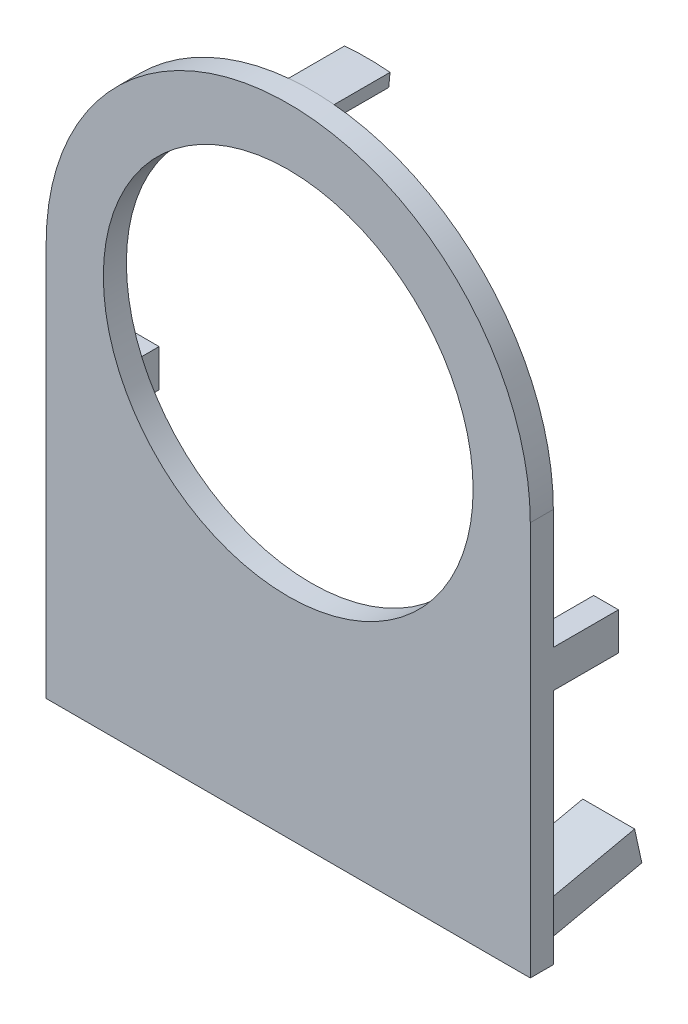
ISO-10303-21;
HEADER;
FILE_DESCRIPTION(('STEP AP214'),'2;1');
FILE_NAME('part.step','',(''),(''),'','','');
FILE_SCHEMA(('AUTOMOTIVE_DESIGN { 1 0 10303 214 1 1 1 1 }'));
ENDSEC;
DATA;
#1=APPLICATION_CONTEXT('core data for automotive mechanical design processes');
#2=APPLICATION_PROTOCOL_DEFINITION('international standard','automotive_design',2000,#1);
#3=PRODUCT_CONTEXT('',#1,'mechanical');
#4=PRODUCT('Part','Part','',(#3));
#5=PRODUCT_RELATED_PRODUCT_CATEGORY('part','',(#4));
#6=PRODUCT_DEFINITION_FORMATION('','',#4);
#7=PRODUCT_DEFINITION_CONTEXT('part definition',#1,'design');
#8=PRODUCT_DEFINITION('design','',#6,#7);
#9=PRODUCT_DEFINITION_SHAPE('','',#8);
#10=(LENGTH_UNIT() NAMED_UNIT(*) SI_UNIT(.MILLI.,.METRE.));
#11=(NAMED_UNIT(*) PLANE_ANGLE_UNIT() SI_UNIT($,.RADIAN.));
#12=(NAMED_UNIT(*) SI_UNIT($,.STERADIAN.) SOLID_ANGLE_UNIT());
#13=UNCERTAINTY_MEASURE_WITH_UNIT(LENGTH_MEASURE(1.E-05),#10,'distance_accuracy_value','');
#14=(GEOMETRIC_REPRESENTATION_CONTEXT(3) GLOBAL_UNCERTAINTY_ASSIGNED_CONTEXT((#13)) GLOBAL_UNIT_ASSIGNED_CONTEXT((#10,
#11,#12)) REPRESENTATION_CONTEXT('',''));
#15=CARTESIAN_POINT('',(0.,0.,0.));
#16=DIRECTION('',(0.,0.,1.));
#17=DIRECTION('',(1.,0.,0.));
#18=AXIS2_PLACEMENT_3D('',#15,#16,#17);
#19=CARTESIAN_POINT('',(0.,0.,42.));
#20=DIRECTION('',(0.,0.,1.));
#21=DIRECTION('',(1.,0.,0.));
#22=AXIS2_PLACEMENT_3D('',#19,#20,#21);
#23=PLANE('',#22);
#24=CARTESIAN_POINT('',(0.,0.,42.));
#25=DIRECTION('',(0.,0.,1.));
#26=DIRECTION('',(1.,0.,0.));
#27=AXIS2_PLACEMENT_3D('',#24,#25,#26);
#28=CIRCLE('',#27,16.04);
#29=CARTESIAN_POINT('',(16.04,0.,42.));
#30=VERTEX_POINT('',#29);
#31=EDGE_CURVE('E370',#30,#30,#28,.T.);
#32=ORIENTED_EDGE('',*,*,#31,.T.);
#33=EDGE_LOOP('',(#32));
#34=FACE_BOUND('',#33,.T.);
#35=DIRECTION('',(0.,-1.,0.));
#36=VECTOR('',#35,1.);
#37=CARTESIAN_POINT('',(-19.25,-21.4379492860773,42.));
#38=LINE('',#37,#36);
#39=CARTESIAN_POINT('',(-19.25,-31.2047703418054,42.));
#40=VERTEX_POINT('',#39);
#41=CARTESIAN_POINT('',(-19.25,-34.2047703418054,42.));
#42=VERTEX_POINT('',#41);
#43=EDGE_CURVE('E218',#40,#42,#38,.T.);
#44=ORIENTED_EDGE('',*,*,#43,.T.);
#45=DIRECTION('',(1.,0.,0.));
#46=VECTOR('',#45,1.);
#47=CARTESIAN_POINT('',(-21.,-34.2047703418054,42.));
#48=LINE('',#47,#46);
#49=CARTESIAN_POINT('',(-21.,-34.2047703418054,42.));
#50=VERTEX_POINT('',#49);
#51=EDGE_CURVE('E377',#50,#42,#48,.T.);
#52=ORIENTED_EDGE('',*,*,#51,.F.);
#53=DIRECTION('',(0.,-1.,0.));
#54=VECTOR('',#53,1.);
#55=CARTESIAN_POINT('',(-21.,-14.0641329223108,42.));
#56=LINE('',#55,#54);
#57=CARTESIAN_POINT('',(-21.,-13.7641329223108,42.));
#58=VERTEX_POINT('',#57);
#59=EDGE_CURVE('E458',#58,#50,#56,.T.);
#60=ORIENTED_EDGE('',*,*,#59,.F.);
#61=DIRECTION('',(1.,0.,0.));
#62=VECTOR('',#61,1.);
#63=CARTESIAN_POINT('',(-21.,-13.7641329223108,42.));
#64=LINE('',#63,#62);
#65=CARTESIAN_POINT('',(-18.85,-13.7641329223108,42.));
#66=VERTEX_POINT('',#65);
#67=EDGE_CURVE('E295',#58,#66,#64,.T.);
#68=ORIENTED_EDGE('',*,*,#67,.T.);
#69=DIRECTION('',(0.,1.,0.));
#70=VECTOR('',#69,1.);
#71=CARTESIAN_POINT('',(-18.85,-10.2141329223108,42.));
#72=LINE('',#71,#70);
#73=CARTESIAN_POINT('',(-18.85,-10.5141329223108,42.));
#74=VERTEX_POINT('',#73);
#75=EDGE_CURVE('E323',#66,#74,#72,.T.);
#76=ORIENTED_EDGE('',*,*,#75,.T.);
#77=DIRECTION('',(-1.,0.,0.));
#78=VECTOR('',#77,1.);
#79=CARTESIAN_POINT('',(-18.85,-10.5141329223108,42.));
#80=LINE('',#79,#78);
#81=CARTESIAN_POINT('',(-21.,-10.5141329223108,42.));
#82=VERTEX_POINT('',#81);
#83=EDGE_CURVE('E303',#74,#82,#80,.T.);
#84=ORIENTED_EDGE('',*,*,#83,.T.);
#85=CARTESIAN_POINT('',(-21.,0.,42.));
#86=VERTEX_POINT('',#85);
#87=EDGE_CURVE('E389',#86,#82,#56,.T.);
#88=ORIENTED_EDGE('',*,*,#87,.F.);
#89=CARTESIAN_POINT('',(0.,0.,42.));
#90=DIRECTION('',(0.,0.,1.));
#91=DIRECTION('',(1.,0.,0.));
#92=AXIS2_PLACEMENT_3D('',#89,#90,#91);
#93=CIRCLE('',#92,21.);
#94=CARTESIAN_POINT('',(-1.78913083156493,20.9236471693523,42.));
#95=VERTEX_POINT('',#94);
#96=EDGE_CURVE('E386',#95,#86,#93,.T.);
#97=ORIENTED_EDGE('',*,*,#96,.F.);
#98=CARTESIAN_POINT('',(1.98333797025892,20.9060681525341,42.));
#99=CARTESIAN_POINT('',(1.32410684495105,20.9688240892851,42.));
#100=CARTESIAN_POINT('',(0.00385608887355169,21.0318291108314,42.));
#101=CARTESIAN_POINT('',(-1.31639466720395,20.9691910581041,42.));
#102=CARTESIAN_POINT('',(-1.97181873184604,20.9071615352025,42.));
#103=B_SPLINE_CURVE_WITH_KNOTS('',3,(#98,#99,#100,#101,#102),.UNSPECIFIED.,.F.,.F.,(4,1,4),
(0.632808650119649,0.654019793730495,0.675107394358108),.UNSPECIFIED.);
#104=CARTESIAN_POINT('',(-1.97181873184604,20.9071615352025,42.));
#105=VERTEX_POINT('',#104);
#106=EDGE_CURVE('E227',#95,#105,#103,.T.);
#107=ORIENTED_EDGE('',*,*,#106,.T.);
#108=DIRECTION('',(0.0942192787541509,-0.99555146904168,0.));
#109=VECTOR('',#108,1.);
#110=CARTESIAN_POINT('',(-1.85894403589857,19.7144908752906,42.));
#111=LINE('',#110,#109);
#112=CARTESIAN_POINT('',(-1.85894403589857,19.7144908752906,42.));
#113=VERTEX_POINT('',#112);
#114=EDGE_CURVE('E413',#105,#113,#111,.T.);
#115=ORIENTED_EDGE('',*,*,#114,.T.);
#116=CARTESIAN_POINT('',(-1.85894403589857,19.7144908752906,42.));
#117=CARTESIAN_POINT('',(-1.54909634243908,19.7438149505485,42.));
#118=CARTESIAN_POINT('',(-0.927804945098241,19.7878796223772,42.));
#119=CARTESIAN_POINT('',(0.00545184072156578,19.8098164315136,42.));
#120=CARTESIAN_POINT('',(0.938704489057926,19.7873617674215,42.));
#121=CARTESIAN_POINT('',(1.55997378818764,19.7429545593892,42.));
#122=CARTESIAN_POINT('',(1.86980684063082,19.7134597999701,42.));
#123=B_SPLINE_CURVE_WITH_KNOTS('',3,(#116,#117,#118,#119,#120,#121,#122),.UNSPECIFIED.,.F.,.F.,
(4,1,1,1,4),(0.632808650119649,0.643383336179264,0.653958022238878,0.664532708298493,
0.675107394358108),.UNSPECIFIED.);
#124=CARTESIAN_POINT('',(1.86980684063082,19.7134597999701,42.));
#125=VERTEX_POINT('',#124);
#126=EDGE_CURVE('E424',#113,#125,#123,.T.);
#127=ORIENTED_EDGE('',*,*,#126,.T.);
#128=DIRECTION('',(0.0947672200568778,0.995499459569261,0.));
#129=VECTOR('',#128,1.);
#130=CARTESIAN_POINT('',(1.86980684063082,19.7134597999701,42.));
#131=LINE('',#130,#129);
#132=CARTESIAN_POINT('',(1.98333797025896,20.9060681525341,42.));
#133=VERTEX_POINT('',#132);
#134=EDGE_CURVE('E417',#125,#133,#131,.T.);
#135=ORIENTED_EDGE('',*,*,#134,.T.);
#136=CARTESIAN_POINT('',(1.78913083154189,20.9236471693542,42.));
#137=VERTEX_POINT('',#136);
#138=EDGE_CURVE('E329',#133,#137,#103,.T.);
#139=ORIENTED_EDGE('',*,*,#138,.T.);
#140=CARTESIAN_POINT('',(21.,0.,42.));
#141=VERTEX_POINT('',#140);
#142=EDGE_CURVE('E393',#141,#137,#93,.T.);
#143=ORIENTED_EDGE('',*,*,#142,.F.);
#144=DIRECTION('',(0.,1.,0.));
#145=VECTOR('',#144,1.);
#146=CARTESIAN_POINT('',(21.,0.,42.));
#147=LINE('',#146,#145);
#148=CARTESIAN_POINT('',(21.,-10.3641329223108,42.));
#149=VERTEX_POINT('',#148);
#150=EDGE_CURVE('E369',#149,#141,#147,.T.);
#151=ORIENTED_EDGE('',*,*,#150,.F.);
#152=DIRECTION('',(-1.,0.,0.));
#153=VECTOR('',#152,1.);
#154=CARTESIAN_POINT('',(18.85,-10.3641329223108,42.));
#155=LINE('',#154,#153);
#156=CARTESIAN_POINT('',(18.85,-10.3641329223108,42.));
#157=VERTEX_POINT('',#156);
#158=EDGE_CURVE('E317',#149,#157,#155,.T.);
#159=ORIENTED_EDGE('',*,*,#158,.T.);
#160=DIRECTION('',(0.,-1.,0.));
#161=VECTOR('',#160,1.);
#162=CARTESIAN_POINT('',(18.85,-10.0641329223108,42.));
#163=LINE('',#162,#161);
#164=CARTESIAN_POINT('',(18.85,-13.6141329223108,42.));
#165=VERTEX_POINT('',#164);
#166=EDGE_CURVE('E326',#157,#165,#163,.T.);
#167=ORIENTED_EDGE('',*,*,#166,.T.);
#168=DIRECTION('',(1.,0.,0.));
#169=VECTOR('',#168,1.);
#170=CARTESIAN_POINT('',(18.85,-13.6141329223108,42.));
#171=LINE('',#170,#169);
#172=CARTESIAN_POINT('',(21.,-13.6141329223108,42.));
#173=VERTEX_POINT('',#172);
#174=EDGE_CURVE('E306',#165,#173,#171,.T.);
#175=ORIENTED_EDGE('',*,*,#174,.T.);
#176=CARTESIAN_POINT('',(21.,-34.2047703418054,42.));
#177=VERTEX_POINT('',#176);
#178=EDGE_CURVE('E384',#177,#173,#147,.T.);
#179=ORIENTED_EDGE('',*,*,#178,.F.);
#180=CARTESIAN_POINT('',(19.25,-34.2047703418054,42.));
#181=VERTEX_POINT('',#180);
#182=EDGE_CURVE('E463',#181,#177,#48,.T.);
#183=ORIENTED_EDGE('',*,*,#182,.F.);
#184=DIRECTION('',(0.,-1.,0.));
#185=VECTOR('',#184,1.);
#186=CARTESIAN_POINT('',(19.25,-21.4379492860773,42.));
#187=LINE('',#186,#185);
#188=CARTESIAN_POINT('',(19.25,-31.2047703418054,42.));
#189=VERTEX_POINT('',#188);
#190=EDGE_CURVE('E497',#189,#181,#187,.T.);
#191=ORIENTED_EDGE('',*,*,#190,.F.);
#192=DIRECTION('',(-1.,0.,0.));
#193=VECTOR('',#192,1.);
#194=CARTESIAN_POINT('',(19.5,-31.2047703418054,42.));
#195=LINE('',#194,#193);
#196=CARTESIAN_POINT('',(14.75,-31.2047703418054,42.));
#197=VERTEX_POINT('',#196);
#198=EDGE_CURVE('E284',#189,#197,#195,.T.);
#199=ORIENTED_EDGE('',*,*,#198,.T.);
#200=DIRECTION('',(0.,-1.,0.));
#201=VECTOR('',#200,1.);
#202=CARTESIAN_POINT('',(14.75,-21.4379492860773,42.));
#203=LINE('',#202,#201);
#204=CARTESIAN_POINT('',(14.75,-34.2047703418054,42.));
#205=VERTEX_POINT('',#204);
#206=EDGE_CURVE('E490',#197,#205,#203,.T.);
#207=ORIENTED_EDGE('',*,*,#206,.T.);
#208=CARTESIAN_POINT('',(-14.75,-34.2047703418054,42.));
#209=VERTEX_POINT('',#208);
#210=EDGE_CURVE('E467',#209,#205,#48,.T.);
#211=ORIENTED_EDGE('',*,*,#210,.F.);
#212=DIRECTION('',(0.,-1.,0.));
#213=VECTOR('',#212,1.);
#214=CARTESIAN_POINT('',(-14.75,-21.4379492860773,42.));
#215=LINE('',#214,#213);
#216=CARTESIAN_POINT('',(-14.75,-31.2047703418054,42.));
#217=VERTEX_POINT('',#216);
#218=EDGE_CURVE('E483',#217,#209,#215,.T.);
#219=ORIENTED_EDGE('',*,*,#218,.F.);
#220=DIRECTION('',(1.,0.,0.));
#221=VECTOR('',#220,1.);
#222=CARTESIAN_POINT('',(-19.5,-31.2047703418054,42.));
#223=LINE('',#222,#221);
#224=EDGE_CURVE('E280',#40,#217,#223,.T.);
#225=ORIENTED_EDGE('',*,*,#224,.F.);
#226=EDGE_LOOP('',(#44,#52,#60,#68,#76,#84,#88,#97,#107,#115,#127,#135,#139,#143,#151,#159,#167,
#175,#179,#183,#191,#199,#207,#211,#219,#225));
#227=FACE_BOUND('',#226,.T.);
#228=ADVANCED_FACE('F39',(#34,#227),#23,.F.);
#229=CARTESIAN_POINT('',(0.,0.,44.));
#230=DIRECTION('',(0.,0.,1.));
#231=DIRECTION('',(1.,0.,0.));
#232=AXIS2_PLACEMENT_3D('',#229,#230,#231);
#233=PLANE('',#232);
#234=DIRECTION('',(0.,1.,0.));
#235=VECTOR('',#234,1.);
#236=CARTESIAN_POINT('',(21.,-34.2047703418054,44.));
#237=LINE('',#236,#235);
#238=CARTESIAN_POINT('',(21.,-34.2047703418054,44.));
#239=VERTEX_POINT('',#238);
#240=CARTESIAN_POINT('',(21.,0.,44.));
#241=VERTEX_POINT('',#240);
#242=EDGE_CURVE('E374',#239,#241,#237,.T.);
#243=ORIENTED_EDGE('',*,*,#242,.T.);
#244=CARTESIAN_POINT('',(0.,0.,44.));
#245=DIRECTION('',(0.,0.,1.));
#246=DIRECTION('',(1.,0.,0.));
#247=AXIS2_PLACEMENT_3D('',#244,#245,#246);
#248=CIRCLE('',#247,21.);
#249=CARTESIAN_POINT('',(-21.,0.,44.));
#250=VERTEX_POINT('',#249);
#251=EDGE_CURVE('E376',#241,#250,#248,.T.);
#252=ORIENTED_EDGE('',*,*,#251,.T.);
#253=DIRECTION('',(0.,-1.,0.));
#254=VECTOR('',#253,1.);
#255=CARTESIAN_POINT('',(-21.,0.,44.));
#256=LINE('',#255,#254);
#257=CARTESIAN_POINT('',(-21.,-34.2047703418054,44.));
#258=VERTEX_POINT('',#257);
#259=EDGE_CURVE('E379',#250,#258,#256,.T.);
#260=ORIENTED_EDGE('',*,*,#259,.T.);
#261=DIRECTION('',(1.,0.,0.));
#262=VECTOR('',#261,1.);
#263=CARTESIAN_POINT('',(-21.,-34.2047703418054,44.));
#264=LINE('',#263,#262);
#265=EDGE_CURVE('E381',#258,#239,#264,.T.);
#266=ORIENTED_EDGE('',*,*,#265,.T.);
#267=EDGE_LOOP('',(#243,#252,#260,#266));
#268=FACE_BOUND('',#267,.T.);
#269=CARTESIAN_POINT('',(0.,0.,44.));
#270=DIRECTION('',(0.,0.,1.));
#271=DIRECTION('',(1.,0.,0.));
#272=AXIS2_PLACEMENT_3D('',#269,#270,#271);
#273=CIRCLE('',#272,16.04);
#274=CARTESIAN_POINT('',(16.04,0.,44.));
#275=VERTEX_POINT('',#274);
#276=EDGE_CURVE('E361',#275,#275,#273,.T.);
#277=ORIENTED_EDGE('',*,*,#276,.F.);
#278=EDGE_LOOP('',(#277));
#279=FACE_BOUND('',#278,.T.);
#280=ADVANCED_FACE('F520',(#268,#279),#233,.T.);
#281=CARTESIAN_POINT('',(21.,0.,44.));
#282=DIRECTION('',(-1.,0.,0.));
#283=DIRECTION('',(0.,-1.,0.));
#284=AXIS2_PLACEMENT_3D('',#281,#282,#283);
#285=PLANE('',#284);
#286=DIRECTION('',(0.,0.,-1.));
#287=VECTOR('',#286,1.);
#288=CARTESIAN_POINT('',(21.,-13.6141329223108,44.1708293346092));
#289=LINE('',#288,#287);
#290=CARTESIAN_POINT('',(21.,-13.6141329223108,36.35));
#291=VERTEX_POINT('',#290);
#292=EDGE_CURVE('E302',#173,#291,#289,.T.);
#293=ORIENTED_EDGE('',*,*,#292,.T.);
#294=DIRECTION('',(0.,-1.,0.));
#295=VECTOR('',#294,1.);
#296=CARTESIAN_POINT('',(21.,-15.1139710254063,36.35));
#297=LINE('',#296,#295);
#298=CARTESIAN_POINT('',(21.,-10.3641329223108,36.35));
#299=VERTEX_POINT('',#298);
#300=EDGE_CURVE('E255',#299,#291,#297,.T.);
#301=ORIENTED_EDGE('',*,*,#300,.F.);
#302=DIRECTION('',(0.,0.,-1.));
#303=VECTOR('',#302,1.);
#304=CARTESIAN_POINT('',(21.,-10.3641329223108,44.1708293346092));
#305=LINE('',#304,#303);
#306=EDGE_CURVE('E309',#149,#299,#305,.T.);
#307=ORIENTED_EDGE('',*,*,#306,.F.);
#308=ORIENTED_EDGE('',*,*,#150,.T.);
#309=DIRECTION('',(0.,0.,-1.));
#310=VECTOR('',#309,1.);
#311=CARTESIAN_POINT('',(21.,0.,44.));
#312=LINE('',#311,#310);
#313=EDGE_CURVE('E399',#241,#141,#312,.T.);
#314=ORIENTED_EDGE('',*,*,#313,.F.);
#315=ORIENTED_EDGE('',*,*,#242,.F.);
#316=DIRECTION('',(0.,0.,-1.));
#317=VECTOR('',#316,1.);
#318=CARTESIAN_POINT('',(21.,-34.2047703418054,44.));
#319=LINE('',#318,#317);
#320=EDGE_CURVE('E383',#239,#177,#319,.T.);
#321=ORIENTED_EDGE('',*,*,#320,.T.);
#322=ORIENTED_EDGE('',*,*,#178,.T.);
#323=EDGE_LOOP('',(#293,#301,#307,#308,#314,#315,#321,#322));
#324=FACE_BOUND('',#323,.T.);
#325=ADVANCED_FACE('F41',(#324),#285,.F.);
#326=CARTESIAN_POINT('',(0.,0.,44.));
#327=DIRECTION('',(0.,0.,-1.));
#328=DIRECTION('',(-1.,0.,0.));
#329=AXIS2_PLACEMENT_3D('',#326,#327,#328);
#330=CYLINDRICAL_SURFACE('',#329,21.);
#331=ORIENTED_EDGE('',*,*,#142,.T.);
#332=CARTESIAN_POINT('',(-1.78913083156494,20.9236471693523,42.));
#333=CARTESIAN_POINT('',(-1.19413395904744,20.9747222381822,42.));
#334=CARTESIAN_POINT('',(-7.7056958903976E-12,21.0261149822509,42.));
#335=CARTESIAN_POINT('',(1.19413395903203,20.9747222381829,42.));
#336=CARTESIAN_POINT('',(1.7891308315419,20.9236471693543,42.));
#337=B_SPLINE_CURVE_WITH_KNOTS('',3,(#332,#333,#334,#335,#336),.UNSPECIFIED.,.F.,.F.,(4,1,4),
(0.634890712877089,0.654019793730742,0.673148874584148),.UNSPECIFIED.);
#338=EDGE_CURVE('E396',#137,#95,#337,.F.);
#339=ORIENTED_EDGE('',*,*,#338,.T.);
#340=ORIENTED_EDGE('',*,*,#96,.T.);
#341=DIRECTION('',(0.,0.,-1.));
#342=VECTOR('',#341,1.);
#343=CARTESIAN_POINT('',(-21.,0.,44.));
#344=LINE('',#343,#342);
#345=EDGE_CURVE('E516',#250,#86,#344,.T.);
#346=ORIENTED_EDGE('',*,*,#345,.F.);
#347=ORIENTED_EDGE('',*,*,#251,.F.);
#348=ORIENTED_EDGE('',*,*,#313,.T.);
#349=EDGE_LOOP('',(#331,#339,#340,#346,#347,#348));
#350=FACE_BOUND('',#349,.T.);
#351=ADVANCED_FACE('F455',(#350),#330,.T.);
#352=CARTESIAN_POINT('',(-21.,-14.0641329223108,44.));
#353=DIRECTION('',(1.,0.,0.));
#354=DIRECTION('',(0.,1.,0.));
#355=AXIS2_PLACEMENT_3D('',#352,#353,#354);
#356=PLANE('',#355);
#357=DIRECTION('',(0.,0.,-1.));
#358=VECTOR('',#357,1.);
#359=CARTESIAN_POINT('',(-21.,-10.5141329223108,44.1708293346092));
#360=LINE('',#359,#358);
#361=CARTESIAN_POINT('',(-21.,-10.5141329223108,36.35));
#362=VERTEX_POINT('',#361);
#363=EDGE_CURVE('E312',#82,#362,#360,.T.);
#364=ORIENTED_EDGE('',*,*,#363,.T.);
#365=DIRECTION('',(0.,-1.,0.));
#366=VECTOR('',#365,1.);
#367=CARTESIAN_POINT('',(-21.,-14.0641329223108,36.35));
#368=LINE('',#367,#366);
#369=CARTESIAN_POINT('',(-21.,-13.7641329223108,36.35));
#370=VERTEX_POINT('',#369);
#371=EDGE_CURVE('E265',#362,#370,#368,.T.);
#372=ORIENTED_EDGE('',*,*,#371,.T.);
#373=DIRECTION('',(0.,0.,-1.));
#374=VECTOR('',#373,1.);
#375=CARTESIAN_POINT('',(-21.,-13.7641329223108,44.1708293346092));
#376=LINE('',#375,#374);
#377=EDGE_CURVE('E289',#58,#370,#376,.T.);
#378=ORIENTED_EDGE('',*,*,#377,.F.);
#379=ORIENTED_EDGE('',*,*,#59,.T.);
#380=DIRECTION('',(0.,0.,-1.));
#381=VECTOR('',#380,1.);
#382=CARTESIAN_POINT('',(-21.,-34.2047703418054,44.));
#383=LINE('',#382,#381);
#384=EDGE_CURVE('E476',#258,#50,#383,.T.);
#385=ORIENTED_EDGE('',*,*,#384,.F.);
#386=ORIENTED_EDGE('',*,*,#259,.F.);
#387=ORIENTED_EDGE('',*,*,#345,.T.);
#388=ORIENTED_EDGE('',*,*,#87,.T.);
#389=EDGE_LOOP('',(#364,#372,#378,#379,#385,#386,#387,#388));
#390=FACE_BOUND('',#389,.T.);
#391=ADVANCED_FACE('F518',(#390),#356,.F.);
#392=CARTESIAN_POINT('',(-21.,-34.2047703418054,44.));
#393=DIRECTION('',(0.,1.,0.));
#394=DIRECTION('',(0.,0.,1.));
#395=AXIS2_PLACEMENT_3D('',#392,#393,#394);
#396=PLANE('',#395);
#397=ORIENTED_EDGE('',*,*,#51,.T.);
#398=DIRECTION('',(-1.,0.,0.));
#399=VECTOR('',#398,1.);
#400=CARTESIAN_POINT('',(-19.5,-34.2047703418054,42.));
#401=LINE('',#400,#399);
#402=EDGE_CURVE('E217',#209,#42,#401,.T.);
#403=ORIENTED_EDGE('',*,*,#402,.F.);
#404=ORIENTED_EDGE('',*,*,#210,.T.);
#405=DIRECTION('',(-1.,0.,0.));
#406=VECTOR('',#405,1.);
#407=CARTESIAN_POINT('',(19.5,-34.2047703418054,42.));
#408=LINE('',#407,#406);
#409=EDGE_CURVE('E286',#181,#205,#408,.T.);
#410=ORIENTED_EDGE('',*,*,#409,.F.);
#411=ORIENTED_EDGE('',*,*,#182,.T.);
#412=ORIENTED_EDGE('',*,*,#320,.F.);
#413=ORIENTED_EDGE('',*,*,#265,.F.);
#414=ORIENTED_EDGE('',*,*,#384,.T.);
#415=EDGE_LOOP('',(#397,#403,#404,#410,#411,#412,#413,#414));
#416=FACE_BOUND('',#415,.T.);
#417=ADVANCED_FACE('F474',(#416),#396,.F.);
#418=CARTESIAN_POINT('',(0.,0.,44.));
#419=DIRECTION('',(0.,0.,-1.));
#420=DIRECTION('',(-1.,0.,0.));
#421=AXIS2_PLACEMENT_3D('',#418,#419,#420);
#422=CYLINDRICAL_SURFACE('',#421,16.04);
#423=ORIENTED_EDGE('',*,*,#276,.T.);
#424=EDGE_LOOP('',(#423));
#425=FACE_BOUND('',#424,.T.);
#426=ORIENTED_EDGE('',*,*,#31,.F.);
#427=EDGE_LOOP('',(#426));
#428=FACE_BOUND('',#427,.T.);
#429=ADVANCED_FACE('F350',(#425,#428),#422,.F.);
#430=CARTESIAN_POINT('',(1.98333797025892,20.9060681525341,37.));
#431=CARTESIAN_POINT('',(1.32410684495105,20.9688240892851,37.));
#432=CARTESIAN_POINT('',(0.00385608887355169,21.0318291108314,37.));
#433=CARTESIAN_POINT('',(-1.31639466720395,20.9691910581041,37.));
#434=CARTESIAN_POINT('',(-1.97181873184604,20.9071615352025,37.));
#435=B_SPLINE_CURVE_WITH_KNOTS('',3,(#430,#431,#432,#433,#434),.UNSPECIFIED.,.F.,.F.,(4,1,4),
(0.632808650119649,0.654019793730495,0.675107394358108),.UNSPECIFIED.);
#436=DIRECTION('',(0.,0.,1.));
#437=VECTOR('',#436,1.);
#438=SURFACE_OF_LINEAR_EXTRUSION('',#435,#437);
#439=CARTESIAN_POINT('',(1.98333797025892,20.9060681525341,37.15));
#440=CARTESIAN_POINT('',(1.32410684495105,20.9688240892851,37.15));
#441=CARTESIAN_POINT('',(0.00385608887355169,21.0318291108314,37.15));
#442=CARTESIAN_POINT('',(-1.31639466720395,20.9691910581041,37.15));
#443=CARTESIAN_POINT('',(-1.97181873184604,20.9071615352025,37.15));
#444=B_SPLINE_CURVE_WITH_KNOTS('',3,(#439,#440,#441,#442,#443),.UNSPECIFIED.,.F.,.F.,(4,1,4),
(0.632808650119649,0.654019793730495,0.675107394358108),.UNSPECIFIED.);
#445=CARTESIAN_POINT('',(-1.97181873184604,20.9071615352025,37.15));
#446=VERTEX_POINT('',#445);
#447=CARTESIAN_POINT('',(1.98333797025896,20.9060681525341,37.15));
#448=VERTEX_POINT('',#447);
#449=EDGE_CURVE('E257',#446,#448,#444,.F.);
#450=ORIENTED_EDGE('',*,*,#449,.F.);
#451=DIRECTION('',(0.,0.,1.));
#452=VECTOR('',#451,1.);
#453=CARTESIAN_POINT('',(-1.97181873184604,20.9071615352025,37.));
#454=LINE('',#453,#452);
#455=EDGE_CURVE('E414',#446,#105,#454,.T.);
#456=ORIENTED_EDGE('',*,*,#455,.T.);
#457=ORIENTED_EDGE('',*,*,#106,.F.);
#458=ORIENTED_EDGE('',*,*,#338,.F.);
#459=ORIENTED_EDGE('',*,*,#138,.F.);
#460=DIRECTION('',(0.,0.,1.));
#461=VECTOR('',#460,1.);
#462=CARTESIAN_POINT('',(1.98333797025896,20.9060681525341,37.));
#463=LINE('',#462,#461);
#464=EDGE_CURVE('E373',#448,#133,#463,.T.);
#465=ORIENTED_EDGE('',*,*,#464,.F.);
#466=EDGE_LOOP('',(#450,#456,#457,#458,#459,#465));
#467=FACE_BOUND('',#466,.T.);
#468=ADVANCED_FACE('F344',(#467),#438,.T.);
#469=CARTESIAN_POINT('',(1.86980684063082,19.7134597999701,37.));
#470=DIRECTION('',(0.995499459569261,-0.0947672200568778,0.));
#471=DIRECTION('',(0.0947672200568778,0.995499459569261,0.));
#472=AXIS2_PLACEMENT_3D('',#469,#470,#471);
#473=PLANE('',#472);
#474=DIRECTION('',(-0.0947672200568778,-0.995499459569261,0.));
#475=VECTOR('',#474,1.);
#476=CARTESIAN_POINT('',(2.06990503626383,21.8154276058622,37.15));
#477=LINE('',#476,#475);
#478=CARTESIAN_POINT('',(1.86980684063082,19.7134597999701,37.15));
#479=VERTEX_POINT('',#478);
#480=EDGE_CURVE('E500',#448,#479,#477,.T.);
#481=ORIENTED_EDGE('',*,*,#480,.F.);
#482=ORIENTED_EDGE('',*,*,#464,.T.);
#483=ORIENTED_EDGE('',*,*,#134,.F.);
#484=DIRECTION('',(0.,0.,1.));
#485=VECTOR('',#484,1.);
#486=CARTESIAN_POINT('',(1.86980684063082,19.7134597999701,37.));
#487=LINE('',#486,#485);
#488=EDGE_CURVE('E419',#479,#125,#487,.T.);
#489=ORIENTED_EDGE('',*,*,#488,.F.);
#490=EDGE_LOOP('',(#481,#482,#483,#489));
#491=FACE_BOUND('',#490,.T.);
#492=ADVANCED_FACE('F349',(#491),#473,.T.);
#493=CARTESIAN_POINT('',(-1.85894403589857,19.7144908752906,37.));
#494=CARTESIAN_POINT('',(-1.54909634243908,19.7438149505485,37.));
#495=CARTESIAN_POINT('',(-0.927804945098241,19.7878796223772,37.));
#496=CARTESIAN_POINT('',(0.00545184072156578,19.8098164315136,37.));
#497=CARTESIAN_POINT('',(0.938704489057926,19.7873617674215,37.));
#498=CARTESIAN_POINT('',(1.55997378818764,19.7429545593892,37.));
#499=CARTESIAN_POINT('',(1.86980684063082,19.7134597999701,37.));
#500=B_SPLINE_CURVE_WITH_KNOTS('',3,(#493,#494,#495,#496,#497,#498,#499),.UNSPECIFIED.,.F.,.F.,
(4,1,1,1,4),(0.632808650119649,0.643383336179264,0.653958022238878,0.664532708298493,
0.675107394358108),.UNSPECIFIED.);
#501=DIRECTION('',(0.,0.,1.));
#502=VECTOR('',#501,1.);
#503=SURFACE_OF_LINEAR_EXTRUSION('',#500,#502);
#504=CARTESIAN_POINT('',(-1.85894403589857,19.7144908752906,37.15));
#505=CARTESIAN_POINT('',(-1.54909634243908,19.7438149505485,37.15));
#506=CARTESIAN_POINT('',(-0.927804945098241,19.7878796223772,37.15));
#507=CARTESIAN_POINT('',(0.00545184072156578,19.8098164315136,37.15));
#508=CARTESIAN_POINT('',(0.938704489057926,19.7873617674215,37.15));
#509=CARTESIAN_POINT('',(1.55997378818764,19.7429545593892,37.15));
#510=CARTESIAN_POINT('',(1.86980684063082,19.7134597999701,37.15));
#511=B_SPLINE_CURVE_WITH_KNOTS('',3,(#504,#505,#506,#507,#508,#509,#510),.UNSPECIFIED.,.F.,.F.,
(4,1,1,1,4),(0.632808650119649,0.643383336179264,0.653958022238878,0.664532708298493,
0.675107394358108),.UNSPECIFIED.);
#512=CARTESIAN_POINT('',(-1.85894403589857,19.7144908752906,37.15));
#513=VERTEX_POINT('',#512);
#514=EDGE_CURVE('E446',#479,#513,#511,.F.);
#515=ORIENTED_EDGE('',*,*,#514,.F.);
#516=ORIENTED_EDGE('',*,*,#488,.T.);
#517=ORIENTED_EDGE('',*,*,#126,.F.);
#518=DIRECTION('',(0.,0.,1.));
#519=VECTOR('',#518,1.);
#520=CARTESIAN_POINT('',(-1.85894403589857,19.7144908752906,37.));
#521=LINE('',#520,#519);
#522=EDGE_CURVE('E416',#513,#113,#521,.T.);
#523=ORIENTED_EDGE('',*,*,#522,.F.);
#524=EDGE_LOOP('',(#515,#516,#517,#523));
#525=FACE_BOUND('',#524,.T.);
#526=ADVANCED_FACE('F443',(#525),#503,.T.);
#527=CARTESIAN_POINT('',(-1.85894403589857,19.7144908752906,37.));
#528=DIRECTION('',(-0.99555146904168,-0.0942192787541509,0.));
#529=DIRECTION('',(0.0942192787541509,-0.99555146904168,0.));
#530=AXIS2_PLACEMENT_3D('',#527,#528,#529);
#531=PLANE('',#530);
#532=DIRECTION('',(-0.0942192787541509,0.99555146904168,0.));
#533=VECTOR('',#532,1.);
#534=CARTESIAN_POINT('',(-1.85894403589857,19.7144908752906,37.15));
#535=LINE('',#534,#533);
#536=EDGE_CURVE('E221',#513,#446,#535,.T.);
#537=ORIENTED_EDGE('',*,*,#536,.F.);
#538=ORIENTED_EDGE('',*,*,#522,.T.);
#539=ORIENTED_EDGE('',*,*,#114,.F.);
#540=ORIENTED_EDGE('',*,*,#455,.F.);
#541=EDGE_LOOP('',(#537,#538,#539,#540));
#542=FACE_BOUND('',#541,.T.);
#543=ADVANCED_FACE('F352',(#542),#531,.T.);
#544=CARTESIAN_POINT('',(-18.85,-10.2141329223108,46.380314673286));
#545=DIRECTION('',(-1.,0.,0.));
#546=DIRECTION('',(0.,0.,1.));
#547=AXIS2_PLACEMENT_3D('',#544,#545,#546);
#548=PLANE('',#547);
#549=DIRECTION('',(0.,0.,-1.));
#550=VECTOR('',#549,1.);
#551=CARTESIAN_POINT('',(-18.85,-13.7641329223108,44.1708293346092));
#552=LINE('',#551,#550);
#553=CARTESIAN_POINT('',(-18.85,-13.7641329223108,36.35));
#554=VERTEX_POINT('',#553);
#555=EDGE_CURVE('E292',#66,#554,#552,.T.);
#556=ORIENTED_EDGE('',*,*,#555,.T.);
#557=DIRECTION('',(0.,1.,0.));
#558=VECTOR('',#557,1.);
#559=CARTESIAN_POINT('',(-18.85,-10.2141329223108,36.35));
#560=LINE('',#559,#558);
#561=CARTESIAN_POINT('',(-18.85,-10.5141329223108,36.35));
#562=VERTEX_POINT('',#561);
#563=EDGE_CURVE('E262',#554,#562,#560,.T.);
#564=ORIENTED_EDGE('',*,*,#563,.T.);
#565=DIRECTION('',(0.,0.,-1.));
#566=VECTOR('',#565,1.);
#567=CARTESIAN_POINT('',(-18.85,-10.5141329223108,44.1708293346092));
#568=LINE('',#567,#566);
#569=EDGE_CURVE('E298',#74,#562,#568,.T.);
#570=ORIENTED_EDGE('',*,*,#569,.F.);
#571=ORIENTED_EDGE('',*,*,#75,.F.);
#572=EDGE_LOOP('',(#556,#564,#570,#571));
#573=FACE_BOUND('',#572,.T.);
#574=ADVANCED_FACE('F665',(#573),#548,.F.);
#575=CARTESIAN_POINT('',(18.85,-10.0641329223108,46.380314673286));
#576=DIRECTION('',(1.,0.,0.));
#577=DIRECTION('',(0.,0.,-1.));
#578=AXIS2_PLACEMENT_3D('',#575,#576,#577);
#579=PLANE('',#578);
#580=DIRECTION('',(0.,0.,-1.));
#581=VECTOR('',#580,1.);
#582=CARTESIAN_POINT('',(18.85,-10.3641329223108,44.1708293346092));
#583=LINE('',#582,#581);
#584=CARTESIAN_POINT('',(18.85,-10.3641329223108,36.35));
#585=VERTEX_POINT('',#584);
#586=EDGE_CURVE('E320',#157,#585,#583,.T.);
#587=ORIENTED_EDGE('',*,*,#586,.T.);
#588=DIRECTION('',(0.,-1.,0.));
#589=VECTOR('',#588,1.);
#590=CARTESIAN_POINT('',(18.85,-10.0641329223108,36.35));
#591=LINE('',#590,#589);
#592=CARTESIAN_POINT('',(18.85,-13.6141329223108,36.35));
#593=VERTEX_POINT('',#592);
#594=EDGE_CURVE('E274',#585,#593,#591,.T.);
#595=ORIENTED_EDGE('',*,*,#594,.T.);
#596=DIRECTION('',(0.,0.,-1.));
#597=VECTOR('',#596,1.);
#598=CARTESIAN_POINT('',(18.85,-13.6141329223108,44.1708293346092));
#599=LINE('',#598,#597);
#600=EDGE_CURVE('E299',#165,#593,#599,.T.);
#601=ORIENTED_EDGE('',*,*,#600,.F.);
#602=ORIENTED_EDGE('',*,*,#166,.F.);
#603=EDGE_LOOP('',(#587,#595,#601,#602));
#604=FACE_BOUND('',#603,.T.);
#605=ADVANCED_FACE('F532',(#604),#579,.F.);
#606=CARTESIAN_POINT('',(18.85,-10.3641329223108,44.1708293346092));
#607=DIRECTION('',(0.,-1.,0.));
#608=DIRECTION('',(0.,0.,-1.));
#609=AXIS2_PLACEMENT_3D('',#606,#607,#608);
#610=PLANE('',#609);
#611=ORIENTED_EDGE('',*,*,#306,.T.);
#612=DIRECTION('',(-1.,0.,0.));
#613=VECTOR('',#612,1.);
#614=CARTESIAN_POINT('',(18.85,-10.3641329223108,36.35));
#615=LINE('',#614,#613);
#616=EDGE_CURVE('E277',#299,#585,#615,.T.);
#617=ORIENTED_EDGE('',*,*,#616,.T.);
#618=ORIENTED_EDGE('',*,*,#586,.F.);
#619=ORIENTED_EDGE('',*,*,#158,.F.);
#620=EDGE_LOOP('',(#611,#617,#618,#619));
#621=FACE_BOUND('',#620,.T.);
#622=ADVANCED_FACE('F530',(#621),#610,.F.);
#623=CARTESIAN_POINT('',(18.85,-13.6141329223108,44.1708293346092));
#624=DIRECTION('',(0.,1.,0.));
#625=DIRECTION('',(0.,0.,1.));
#626=AXIS2_PLACEMENT_3D('',#623,#624,#625);
#627=PLANE('',#626);
#628=ORIENTED_EDGE('',*,*,#600,.T.);
#629=DIRECTION('',(1.,0.,0.));
#630=VECTOR('',#629,1.);
#631=CARTESIAN_POINT('',(18.85,-13.6141329223108,36.35));
#632=LINE('',#631,#630);
#633=EDGE_CURVE('E271',#593,#291,#632,.T.);
#634=ORIENTED_EDGE('',*,*,#633,.T.);
#635=ORIENTED_EDGE('',*,*,#292,.F.);
#636=ORIENTED_EDGE('',*,*,#174,.F.);
#637=EDGE_LOOP('',(#628,#634,#635,#636));
#638=FACE_BOUND('',#637,.T.);
#639=ADVANCED_FACE('F536',(#638),#627,.F.);
#640=CARTESIAN_POINT('',(-21.,-13.7641329223108,44.1708293346092));
#641=DIRECTION('',(0.,1.,0.));
#642=DIRECTION('',(0.,0.,1.));
#643=AXIS2_PLACEMENT_3D('',#640,#641,#642);
#644=PLANE('',#643);
#645=ORIENTED_EDGE('',*,*,#377,.T.);
#646=DIRECTION('',(1.,0.,0.));
#647=VECTOR('',#646,1.);
#648=CARTESIAN_POINT('',(-21.,-13.7641329223108,36.35));
#649=LINE('',#648,#647);
#650=EDGE_CURVE('E268',#370,#554,#649,.T.);
#651=ORIENTED_EDGE('',*,*,#650,.T.);
#652=ORIENTED_EDGE('',*,*,#555,.F.);
#653=ORIENTED_EDGE('',*,*,#67,.F.);
#654=EDGE_LOOP('',(#645,#651,#652,#653));
#655=FACE_BOUND('',#654,.T.);
#656=ADVANCED_FACE('F806',(#655),#644,.F.);
#657=CARTESIAN_POINT('',(-18.85,-10.5141329223108,44.1708293346092));
#658=DIRECTION('',(0.,-1.,0.));
#659=DIRECTION('',(0.,0.,-1.));
#660=AXIS2_PLACEMENT_3D('',#657,#658,#659);
#661=PLANE('',#660);
#662=ORIENTED_EDGE('',*,*,#569,.T.);
#663=DIRECTION('',(-1.,0.,0.));
#664=VECTOR('',#663,1.);
#665=CARTESIAN_POINT('',(-18.85,-10.5141329223108,36.35));
#666=LINE('',#665,#664);
#667=EDGE_CURVE('E222',#562,#362,#666,.T.);
#668=ORIENTED_EDGE('',*,*,#667,.T.);
#669=ORIENTED_EDGE('',*,*,#363,.F.);
#670=ORIENTED_EDGE('',*,*,#83,.F.);
#671=EDGE_LOOP('',(#662,#668,#669,#670));
#672=FACE_BOUND('',#671,.T.);
#673=ADVANCED_FACE('F702',(#672),#661,.F.);
#674=CARTESIAN_POINT('',(19.5,-32.072761245289,32.2299162126228));
#675=DIRECTION('',(0.,0.977008378737724,0.213200909651636));
#676=DIRECTION('',(0.,-0.213200909651636,0.977008378737724));
#677=AXIS2_PLACEMENT_3D('',#674,#675,#676);
#678=PLANE('',#677);
#679=ORIENTED_EDGE('',*,*,#409,.T.);
#680=DIRECTION('',(0.,-0.213200909651636,0.977008378737724));
#681=VECTOR('',#680,1.);
#682=CARTESIAN_POINT('',(14.75,-32.1473815636671,32.571869145181));
#683=LINE('',#682,#681);
#684=CARTESIAN_POINT('',(14.75,-32.1473815636671,32.571869145181));
#685=VERTEX_POINT('',#684);
#686=EDGE_CURVE('E480',#685,#205,#683,.T.);
#687=ORIENTED_EDGE('',*,*,#686,.F.);
#688=DIRECTION('',(1.,0.,0.));
#689=VECTOR('',#688,1.);
#690=CARTESIAN_POINT('',(19.5,-32.1473815636671,32.571869145181));
#691=LINE('',#690,#689);
#692=CARTESIAN_POINT('',(19.25,-32.1473815636671,32.571869145181));
#693=VERTEX_POINT('',#692);
#694=EDGE_CURVE('E241',#685,#693,#691,.T.);
#695=ORIENTED_EDGE('',*,*,#694,.T.);
#696=DIRECTION('',(0.,0.213200909651636,-0.977008378737723));
#697=VECTOR('',#696,1.);
#698=CARTESIAN_POINT('',(19.25,-34.2047703418054,42.));
#699=LINE('',#698,#697);
#700=EDGE_CURVE('E493',#181,#693,#699,.T.);
#701=ORIENTED_EDGE('',*,*,#700,.F.);
#702=EDGE_LOOP('',(#679,#687,#695,#701));
#703=FACE_BOUND('',#702,.T.);
#704=ADVANCED_FACE('F697',(#703),#678,.F.);
#705=CARTESIAN_POINT('',(19.5,-29.072761245289,32.2299162126228));
#706=DIRECTION('',(0.,0.977008378737724,0.213200909651636));
#707=DIRECTION('',(0.,-0.213200909651636,0.977008378737724));
#708=AXIS2_PLACEMENT_3D('',#705,#706,#707);
#709=PLANE('',#708);
#710=DIRECTION('',(0.,-0.213200909651636,0.977008378737724));
#711=VECTOR('',#710,1.);
#712=CARTESIAN_POINT('',(14.75,-28.7034343470447,30.5374493527604));
#713=LINE('',#712,#711);
#714=CARTESIAN_POINT('',(14.75,-29.283745447296,33.1967663704334));
#715=VERTEX_POINT('',#714);
#716=EDGE_CURVE('E250',#715,#197,#713,.T.);
#717=ORIENTED_EDGE('',*,*,#716,.T.);
#718=ORIENTED_EDGE('',*,*,#198,.F.);
#719=DIRECTION('',(0.,0.213200909651636,-0.977008378737724));
#720=VECTOR('',#719,1.);
#721=CARTESIAN_POINT('',(19.25,-30.760823125183,39.9655802075794));
#722=LINE('',#721,#720);
#723=CARTESIAN_POINT('',(19.25,-29.283745447296,33.1967663704334));
#724=VERTEX_POINT('',#723);
#725=EDGE_CURVE('E252',#189,#724,#722,.T.);
#726=ORIENTED_EDGE('',*,*,#725,.T.);
#727=DIRECTION('',(1.,0.,0.));
#728=VECTOR('',#727,1.);
#729=CARTESIAN_POINT('',(19.5,-29.283745447296,33.1967663704334));
#730=LINE('',#729,#728);
#731=EDGE_CURVE('E239',#715,#724,#730,.T.);
#732=ORIENTED_EDGE('',*,*,#731,.F.);
#733=EDGE_LOOP('',(#717,#718,#726,#732));
#734=FACE_BOUND('',#733,.T.);
#735=ADVANCED_FACE('F248',(#734),#709,.T.);
#736=CARTESIAN_POINT('',(-19.5,-29.072761245289,32.2299162126228));
#737=DIRECTION('',(0.,-0.977008378737724,-0.213200909651636));
#738=DIRECTION('',(0.,0.213200909651636,-0.977008378737724));
#739=AXIS2_PLACEMENT_3D('',#736,#737,#738);
#740=PLANE('',#739);
#741=DIRECTION('',(-1.,0.,0.));
#742=VECTOR('',#741,1.);
#743=CARTESIAN_POINT('',(-19.5,-29.283745447296,33.1967663704334));
#744=LINE('',#743,#742);
#745=CARTESIAN_POINT('',(-14.75,-29.283745447296,33.1967663704334));
#746=VERTEX_POINT('',#745);
#747=CARTESIAN_POINT('',(-19.25,-29.283745447296,33.1967663704334));
#748=VERTEX_POINT('',#747);
#749=EDGE_CURVE('E253',#746,#748,#744,.T.);
#750=ORIENTED_EDGE('',*,*,#749,.T.);
#751=DIRECTION('',(0.,0.213200909651636,-0.977008378737724));
#752=VECTOR('',#751,1.);
#753=CARTESIAN_POINT('',(-19.25,-30.760823125183,39.9655802075794));
#754=LINE('',#753,#752);
#755=EDGE_CURVE('E62',#40,#748,#754,.T.);
#756=ORIENTED_EDGE('',*,*,#755,.F.);
#757=ORIENTED_EDGE('',*,*,#224,.T.);
#758=DIRECTION('',(0.,-0.213200909651636,0.977008378737724));
#759=VECTOR('',#758,1.);
#760=CARTESIAN_POINT('',(-14.75,-28.7034343470447,30.5374493527604));
#761=LINE('',#760,#759);
#762=EDGE_CURVE('E485',#746,#217,#761,.T.);
#763=ORIENTED_EDGE('',*,*,#762,.F.);
#764=EDGE_LOOP('',(#750,#756,#757,#763));
#765=FACE_BOUND('',#764,.T.);
#766=ADVANCED_FACE('F715',(#765),#740,.F.);
#767=CARTESIAN_POINT('',(-19.5,-32.072761245289,32.2299162126228));
#768=DIRECTION('',(0.,0.977008378737724,0.213200909651636));
#769=DIRECTION('',(0.,-0.213200909651636,0.977008378737724));
#770=AXIS2_PLACEMENT_3D('',#767,#768,#769);
#771=PLANE('',#770);
#772=ORIENTED_EDGE('',*,*,#402,.T.);
#773=DIRECTION('',(0.,-0.213200909651636,0.977008378737724));
#774=VECTOR('',#773,1.);
#775=CARTESIAN_POINT('',(-19.25,-34.2047703418054,42.));
#776=LINE('',#775,#774);
#777=CARTESIAN_POINT('',(-19.25,-32.1473815636671,32.571869145181));
#778=VERTEX_POINT('',#777);
#779=EDGE_CURVE('E206',#778,#42,#776,.T.);
#780=ORIENTED_EDGE('',*,*,#779,.F.);
#781=DIRECTION('',(1.,0.,0.));
#782=VECTOR('',#781,1.);
#783=CARTESIAN_POINT('',(-19.5,-32.1473815636671,32.571869145181));
#784=LINE('',#783,#782);
#785=CARTESIAN_POINT('',(-14.75,-32.1473815636671,32.571869145181));
#786=VERTEX_POINT('',#785);
#787=EDGE_CURVE('E215',#778,#786,#784,.T.);
#788=ORIENTED_EDGE('',*,*,#787,.T.);
#789=DIRECTION('',(0.,0.213200909651636,-0.977008378737724));
#790=VECTOR('',#789,1.);
#791=CARTESIAN_POINT('',(-14.75,-32.1473815636671,32.571869145181));
#792=LINE('',#791,#790);
#793=EDGE_CURVE('E54',#209,#786,#792,.T.);
#794=ORIENTED_EDGE('',*,*,#793,.F.);
#795=EDGE_LOOP('',(#772,#780,#788,#794));
#796=FACE_BOUND('',#795,.T.);
#797=ADVANCED_FACE('F214',(#796),#771,.F.);
#798=CARTESIAN_POINT('',(-33.95,-15.1139710254062,36.35));
#799=DIRECTION('',(0.,0.,1.));
#800=DIRECTION('',(1.,0.,0.));
#801=AXIS2_PLACEMENT_3D('',#798,#799,#800);
#802=PLANE('',#801);
#803=ORIENTED_EDGE('',*,*,#371,.F.);
#804=ORIENTED_EDGE('',*,*,#667,.F.);
#805=ORIENTED_EDGE('',*,*,#563,.F.);
#806=ORIENTED_EDGE('',*,*,#650,.F.);
#807=EDGE_LOOP('',(#803,#804,#805,#806));
#808=FACE_BOUND('',#807,.T.);
#809=ADVANCED_FACE('F541',(#808),#802,.F.);
#810=ORIENTED_EDGE('',*,*,#300,.T.);
#811=ORIENTED_EDGE('',*,*,#633,.F.);
#812=ORIENTED_EDGE('',*,*,#594,.F.);
#813=ORIENTED_EDGE('',*,*,#616,.F.);
#814=EDGE_LOOP('',(#810,#811,#812,#813));
#815=FACE_BOUND('',#814,.T.);
#816=ADVANCED_FACE('F539',(#815),#802,.F.);
#817=CARTESIAN_POINT('',(-35.45,-28.8047584770046,33.3012899958187));
#818=DIRECTION('',(0.,-0.213200909651641,0.977008378737722));
#819=DIRECTION('',(0.,-0.977008378737723,-0.213200909651641));
#820=AXIS2_PLACEMENT_3D('',#817,#818,#819);
#821=PLANE('',#820);
#822=ORIENTED_EDGE('',*,*,#787,.F.);
#823=DIRECTION('',(0.,0.977008378737723,0.213200909651641));
#824=VECTOR('',#823,1.);
#825=CARTESIAN_POINT('',(-19.25,-28.8047584770046,33.3012899958187));
#826=LINE('',#825,#824);
#827=EDGE_CURVE('E11',#778,#748,#826,.T.);
#828=ORIENTED_EDGE('',*,*,#827,.T.);
#829=ORIENTED_EDGE('',*,*,#749,.F.);
#830=DIRECTION('',(0.,-0.977008378737723,-0.213200909651641));
#831=VECTOR('',#830,1.);
#832=CARTESIAN_POINT('',(-14.75,-28.8047584770046,33.3012899958187));
#833=LINE('',#832,#831);
#834=EDGE_CURVE('E47',#746,#786,#833,.T.);
#835=ORIENTED_EDGE('',*,*,#834,.T.);
#836=EDGE_LOOP('',(#822,#828,#829,#835));
#837=FACE_BOUND('',#836,.T.);
#838=ADVANCED_FACE('F220',(#837),#821,.F.);
#839=ORIENTED_EDGE('',*,*,#694,.F.);
#840=DIRECTION('',(0.,0.977008378737723,0.213200909651641));
#841=VECTOR('',#840,1.);
#842=CARTESIAN_POINT('',(14.75,-28.8047584770046,33.3012899958187));
#843=LINE('',#842,#841);
#844=EDGE_CURVE('E233',#685,#715,#843,.T.);
#845=ORIENTED_EDGE('',*,*,#844,.T.);
#846=ORIENTED_EDGE('',*,*,#731,.T.);
#847=DIRECTION('',(0.,-0.977008378737723,-0.213200909651641));
#848=VECTOR('',#847,1.);
#849=CARTESIAN_POINT('',(19.25,-28.8047584770046,33.3012899958187));
#850=LINE('',#849,#848);
#851=EDGE_CURVE('E224',#724,#693,#850,.T.);
#852=ORIENTED_EDGE('',*,*,#851,.T.);
#853=EDGE_LOOP('',(#839,#845,#846,#852));
#854=FACE_BOUND('',#853,.T.);
#855=ADVANCED_FACE('F238',(#854),#821,.F.);
#856=CARTESIAN_POINT('',(-52.6327902670671,27.0228863479877,37.15));
#857=DIRECTION('',(0.,0.,1.));
#858=DIRECTION('',(1.,0.,0.));
#859=AXIS2_PLACEMENT_3D('',#856,#857,#858);
#860=PLANE('',#859);
#861=ORIENTED_EDGE('',*,*,#449,.T.);
#862=ORIENTED_EDGE('',*,*,#480,.T.);
#863=ORIENTED_EDGE('',*,*,#514,.T.);
#864=ORIENTED_EDGE('',*,*,#536,.T.);
#865=EDGE_LOOP('',(#861,#862,#863,#864));
#866=FACE_BOUND('',#865,.T.);
#867=ADVANCED_FACE('F514',(#866),#860,.F.);
#868=CARTESIAN_POINT('',(19.25,-21.4379492860773,42.));
#869=DIRECTION('',(-1.,0.,0.));
#870=DIRECTION('',(0.,0.,1.));
#871=AXIS2_PLACEMENT_3D('',#868,#869,#870);
#872=PLANE('',#871);
#873=ORIENTED_EDGE('',*,*,#725,.F.);
#874=ORIENTED_EDGE('',*,*,#190,.T.);
#875=ORIENTED_EDGE('',*,*,#700,.T.);
#876=ORIENTED_EDGE('',*,*,#851,.F.);
#877=EDGE_LOOP('',(#873,#874,#875,#876));
#878=FACE_BOUND('',#877,.T.);
#879=ADVANCED_FACE('F675',(#878),#872,.F.);
#880=CARTESIAN_POINT('',(14.75,-19.380560507939,32.571869145181));
#881=DIRECTION('',(1.,0.,0.));
#882=DIRECTION('',(0.,0.,-1.));
#883=AXIS2_PLACEMENT_3D('',#880,#881,#882);
#884=PLANE('',#883);
#885=ORIENTED_EDGE('',*,*,#686,.T.);
#886=ORIENTED_EDGE('',*,*,#206,.F.);
#887=ORIENTED_EDGE('',*,*,#716,.F.);
#888=ORIENTED_EDGE('',*,*,#844,.F.);
#889=EDGE_LOOP('',(#885,#886,#887,#888));
#890=FACE_BOUND('',#889,.T.);
#891=ADVANCED_FACE('F688',(#890),#884,.F.);
#892=CARTESIAN_POINT('',(-14.75,-19.380560507939,32.571869145181));
#893=DIRECTION('',(-1.,0.,0.));
#894=DIRECTION('',(0.,0.,1.));
#895=AXIS2_PLACEMENT_3D('',#892,#893,#894);
#896=PLANE('',#895);
#897=ORIENTED_EDGE('',*,*,#762,.T.);
#898=ORIENTED_EDGE('',*,*,#218,.T.);
#899=ORIENTED_EDGE('',*,*,#793,.T.);
#900=ORIENTED_EDGE('',*,*,#834,.F.);
#901=EDGE_LOOP('',(#897,#898,#899,#900));
#902=FACE_BOUND('',#901,.T.);
#903=ADVANCED_FACE('F732',(#902),#896,.F.);
#904=CARTESIAN_POINT('',(-19.25,-21.4379492860773,42.));
#905=DIRECTION('',(1.,0.,0.));
#906=DIRECTION('',(0.,0.,-1.));
#907=AXIS2_PLACEMENT_3D('',#904,#905,#906);
#908=PLANE('',#907);
#909=ORIENTED_EDGE('',*,*,#779,.T.);
#910=ORIENTED_EDGE('',*,*,#43,.F.);
#911=ORIENTED_EDGE('',*,*,#755,.T.);
#912=ORIENTED_EDGE('',*,*,#827,.F.);
#913=EDGE_LOOP('',(#909,#910,#911,#912));
#914=FACE_BOUND('',#913,.T.);
#915=ADVANCED_FACE('F205',(#914),#908,.F.);
#916=CLOSED_SHELL('',(#228,#280,#325,#351,#391,#417,#429,#468,#492,#526,#543,#574,#605,#622,
#639,#656,#673,#704,#735,#766,#797,#809,#816,#838,#855,#867,#879,#891,#903,#915));
#917=MANIFOLD_SOLID_BREP('B2',#916);
#918=ADVANCED_BREP_SHAPE_REPRESENTATION('',(#18,#917),#14);
#919=SHAPE_DEFINITION_REPRESENTATION(#9,#918);
ENDSEC;
END-ISO-10303-21;
